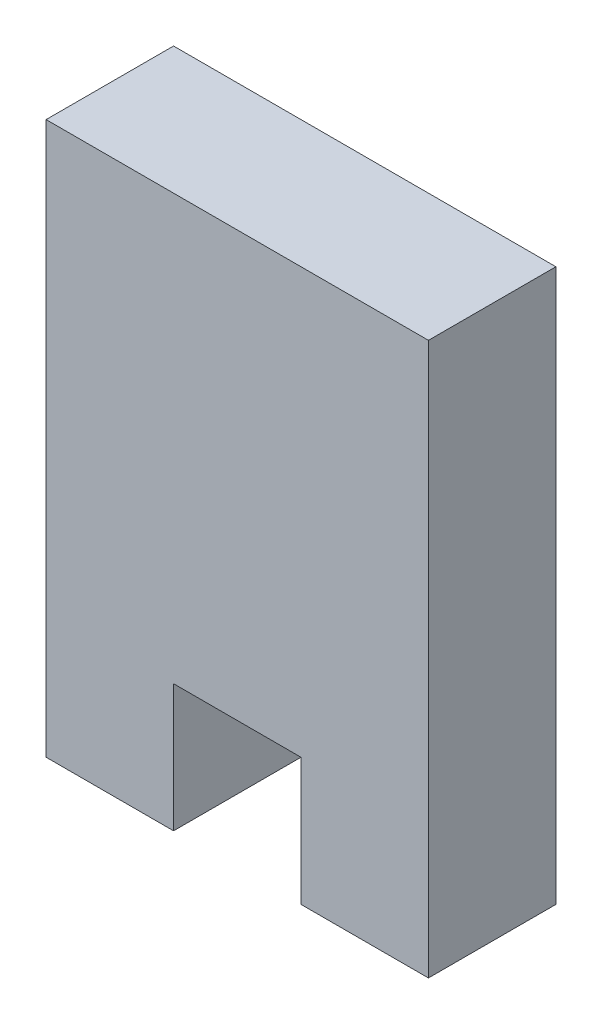
ISO-10303-21;
HEADER;
FILE_DESCRIPTION(('STEP AP214'),'2;1');
FILE_NAME('part.step','',(''),(''),'','','');
FILE_SCHEMA(('AUTOMOTIVE_DESIGN { 1 0 10303 214 1 1 1 1 }'));
ENDSEC;
DATA;
#1=APPLICATION_CONTEXT('core data for automotive mechanical design processes');
#2=APPLICATION_PROTOCOL_DEFINITION('international standard','automotive_design',2000,#1);
#3=PRODUCT_CONTEXT('',#1,'mechanical');
#4=PRODUCT('Part','Part','',(#3));
#5=PRODUCT_RELATED_PRODUCT_CATEGORY('part','',(#4));
#6=PRODUCT_DEFINITION_FORMATION('','',#4);
#7=PRODUCT_DEFINITION_CONTEXT('part definition',#1,'design');
#8=PRODUCT_DEFINITION('design','',#6,#7);
#9=PRODUCT_DEFINITION_SHAPE('','',#8);
#10=(LENGTH_UNIT() NAMED_UNIT(*) SI_UNIT(.MILLI.,.METRE.));
#11=(NAMED_UNIT(*) PLANE_ANGLE_UNIT() SI_UNIT($,.RADIAN.));
#12=(NAMED_UNIT(*) SI_UNIT($,.STERADIAN.) SOLID_ANGLE_UNIT());
#13=UNCERTAINTY_MEASURE_WITH_UNIT(LENGTH_MEASURE(1.E-05),#10,'distance_accuracy_value','');
#14=(GEOMETRIC_REPRESENTATION_CONTEXT(3) GLOBAL_UNCERTAINTY_ASSIGNED_CONTEXT((#13)) GLOBAL_UNIT_ASSIGNED_CONTEXT((#10,
#11,#12)) REPRESENTATION_CONTEXT('',''));
#15=CARTESIAN_POINT('',(0.,0.,0.));
#16=DIRECTION('',(0.,0.,1.));
#17=DIRECTION('',(1.,0.,0.));
#18=AXIS2_PLACEMENT_3D('',#15,#16,#17);
#19=CARTESIAN_POINT('',(-10.5816350683352,-7.34177998721548,3.));
#20=DIRECTION('',(1.,0.,0.));
#21=DIRECTION('',(0.,0.,-1.));
#22=AXIS2_PLACEMENT_3D('',#19,#20,#21);
#23=PLANE('',#22);
#24=DIRECTION('',(0.,-1.,0.));
#25=VECTOR('',#24,1.);
#26=CARTESIAN_POINT('',(-10.5816350683352,-7.34177998721548,0.));
#27=LINE('',#26,#25);
#28=CARTESIAN_POINT('',(-10.5816350683352,-7.34177998721548,0.));
#29=VERTEX_POINT('',#28);
#30=CARTESIAN_POINT('',(-10.5816350683352,-20.3417799872155,0.));
#31=VERTEX_POINT('',#30);
#32=EDGE_CURVE('E132',#29,#31,#27,.T.);
#33=ORIENTED_EDGE('',*,*,#32,.T.);
#34=DIRECTION('',(0.,0.,-1.));
#35=VECTOR('',#34,1.);
#36=CARTESIAN_POINT('',(-10.5816350683352,-20.3417799872155,3.));
#37=LINE('',#36,#35);
#38=CARTESIAN_POINT('',(-10.5816350683352,-20.3417799872155,3.));
#39=VERTEX_POINT('',#38);
#40=EDGE_CURVE('E11',#39,#31,#37,.T.);
#41=ORIENTED_EDGE('',*,*,#40,.F.);
#42=DIRECTION('',(0.,-1.,0.));
#43=VECTOR('',#42,1.);
#44=CARTESIAN_POINT('',(-10.5816350683352,-7.34177998721548,3.));
#45=LINE('',#44,#43);
#46=CARTESIAN_POINT('',(-10.5816350683352,-7.34177998721548,3.));
#47=VERTEX_POINT('',#46);
#48=EDGE_CURVE('E146',#47,#39,#45,.T.);
#49=ORIENTED_EDGE('',*,*,#48,.F.);
#50=DIRECTION('',(0.,0.,-1.));
#51=VECTOR('',#50,1.);
#52=CARTESIAN_POINT('',(-10.5816350683352,-7.34177998721548,3.));
#53=LINE('',#52,#51);
#54=EDGE_CURVE('E128',#47,#29,#53,.T.);
#55=ORIENTED_EDGE('',*,*,#54,.T.);
#56=EDGE_LOOP('',(#33,#41,#49,#55));
#57=FACE_BOUND('',#56,.T.);
#58=ADVANCED_FACE('F36',(#57),#23,.F.);
#59=CARTESIAN_POINT('',(-10.5816350683352,-20.3417799872155,3.));
#60=DIRECTION('',(0.,1.,0.));
#61=DIRECTION('',(-1.,0.,0.));
#62=AXIS2_PLACEMENT_3D('',#59,#60,#61);
#63=PLANE('',#62);
#64=DIRECTION('',(1.,0.,0.));
#65=VECTOR('',#64,1.);
#66=CARTESIAN_POINT('',(-10.5816350683352,-20.3417799872155,0.));
#67=LINE('',#66,#65);
#68=CARTESIAN_POINT('',(-7.5816350683352,-20.3417799872155,0.));
#69=VERTEX_POINT('',#68);
#70=EDGE_CURVE('E135',#31,#69,#67,.T.);
#71=ORIENTED_EDGE('',*,*,#70,.T.);
#72=DIRECTION('',(0.,0.,-1.));
#73=VECTOR('',#72,1.);
#74=CARTESIAN_POINT('',(-7.5816350683352,-20.3417799872155,3.));
#75=LINE('',#74,#73);
#76=CARTESIAN_POINT('',(-7.5816350683352,-20.3417799872155,3.));
#77=VERTEX_POINT('',#76);
#78=EDGE_CURVE('E44',#77,#69,#75,.T.);
#79=ORIENTED_EDGE('',*,*,#78,.F.);
#80=DIRECTION('',(1.,0.,0.));
#81=VECTOR('',#80,1.);
#82=CARTESIAN_POINT('',(-10.5816350683352,-20.3417799872155,3.));
#83=LINE('',#82,#81);
#84=EDGE_CURVE('E95',#39,#77,#83,.T.);
#85=ORIENTED_EDGE('',*,*,#84,.F.);
#86=ORIENTED_EDGE('',*,*,#40,.T.);
#87=EDGE_LOOP('',(#71,#79,#85,#86));
#88=FACE_BOUND('',#87,.T.);
#89=ADVANCED_FACE('F181',(#88),#63,.F.);
#90=CARTESIAN_POINT('',(-7.5816350683352,-17.3417799872155,3.));
#91=DIRECTION('',(-1.,0.,0.));
#92=DIRECTION('',(0.,-1.,0.));
#93=AXIS2_PLACEMENT_3D('',#90,#91,#92);
#94=PLANE('',#93);
#95=DIRECTION('',(0.,1.,0.));
#96=VECTOR('',#95,1.);
#97=CARTESIAN_POINT('',(-7.5816350683352,-17.3417799872155,0.));
#98=LINE('',#97,#96);
#99=CARTESIAN_POINT('',(-7.5816350683352,-17.3417799872155,0.));
#100=VERTEX_POINT('',#99);
#101=EDGE_CURVE('E137',#69,#100,#98,.T.);
#102=ORIENTED_EDGE('',*,*,#101,.T.);
#103=DIRECTION('',(0.,0.,-1.));
#104=VECTOR('',#103,1.);
#105=CARTESIAN_POINT('',(-7.5816350683352,-17.3417799872155,3.));
#106=LINE('',#105,#104);
#107=CARTESIAN_POINT('',(-7.5816350683352,-17.3417799872155,3.));
#108=VERTEX_POINT('',#107);
#109=EDGE_CURVE('E153',#108,#100,#106,.T.);
#110=ORIENTED_EDGE('',*,*,#109,.F.);
#111=DIRECTION('',(0.,1.,0.));
#112=VECTOR('',#111,1.);
#113=CARTESIAN_POINT('',(-7.5816350683352,-17.3417799872155,3.));
#114=LINE('',#113,#112);
#115=EDGE_CURVE('E161',#77,#108,#114,.T.);
#116=ORIENTED_EDGE('',*,*,#115,.F.);
#117=ORIENTED_EDGE('',*,*,#78,.T.);
#118=EDGE_LOOP('',(#102,#110,#116,#117));
#119=FACE_BOUND('',#118,.T.);
#120=ADVANCED_FACE('F159',(#119),#94,.F.);
#121=CARTESIAN_POINT('',(-7.5816350683352,-17.3417799872155,3.));
#122=DIRECTION('',(0.,1.,0.));
#123=DIRECTION('',(-1.,0.,0.));
#124=AXIS2_PLACEMENT_3D('',#121,#122,#123);
#125=PLANE('',#124);
#126=DIRECTION('',(1.,0.,0.));
#127=VECTOR('',#126,1.);
#128=CARTESIAN_POINT('',(-7.5816350683352,-17.3417799872155,0.));
#129=LINE('',#128,#127);
#130=CARTESIAN_POINT('',(-4.5816350683352,-17.3417799872155,0.));
#131=VERTEX_POINT('',#130);
#132=EDGE_CURVE('E139',#100,#131,#129,.T.);
#133=ORIENTED_EDGE('',*,*,#132,.T.);
#134=DIRECTION('',(0.,0.,-1.));
#135=VECTOR('',#134,1.);
#136=CARTESIAN_POINT('',(-4.5816350683352,-17.3417799872155,3.));
#137=LINE('',#136,#135);
#138=CARTESIAN_POINT('',(-4.5816350683352,-17.3417799872155,3.));
#139=VERTEX_POINT('',#138);
#140=EDGE_CURVE('E150',#139,#131,#137,.T.);
#141=ORIENTED_EDGE('',*,*,#140,.F.);
#142=DIRECTION('',(1.,0.,0.));
#143=VECTOR('',#142,1.);
#144=CARTESIAN_POINT('',(-7.5816350683352,-17.3417799872155,3.));
#145=LINE('',#144,#143);
#146=EDGE_CURVE('E173',#108,#139,#145,.T.);
#147=ORIENTED_EDGE('',*,*,#146,.F.);
#148=ORIENTED_EDGE('',*,*,#109,.T.);
#149=EDGE_LOOP('',(#133,#141,#147,#148));
#150=FACE_BOUND('',#149,.T.);
#151=ADVANCED_FACE('F169',(#150),#125,.F.);
#152=CARTESIAN_POINT('',(-4.5816350683352,-17.3417799872155,3.));
#153=DIRECTION('',(1.,0.,0.));
#154=DIRECTION('',(0.,1.,0.));
#155=AXIS2_PLACEMENT_3D('',#152,#153,#154);
#156=PLANE('',#155);
#157=DIRECTION('',(0.,-1.,0.));
#158=VECTOR('',#157,1.);
#159=CARTESIAN_POINT('',(-4.5816350683352,-17.3417799872155,0.));
#160=LINE('',#159,#158);
#161=CARTESIAN_POINT('',(-4.5816350683352,-20.3417799872155,0.));
#162=VERTEX_POINT('',#161);
#163=EDGE_CURVE('E141',#131,#162,#160,.T.);
#164=ORIENTED_EDGE('',*,*,#163,.T.);
#165=DIRECTION('',(0.,0.,-1.));
#166=VECTOR('',#165,1.);
#167=CARTESIAN_POINT('',(-4.5816350683352,-20.3417799872155,3.));
#168=LINE('',#167,#166);
#169=CARTESIAN_POINT('',(-4.5816350683352,-20.3417799872155,3.));
#170=VERTEX_POINT('',#169);
#171=EDGE_CURVE('E123',#170,#162,#168,.T.);
#172=ORIENTED_EDGE('',*,*,#171,.F.);
#173=DIRECTION('',(0.,-1.,0.));
#174=VECTOR('',#173,1.);
#175=CARTESIAN_POINT('',(-4.5816350683352,-17.3417799872155,3.));
#176=LINE('',#175,#174);
#177=EDGE_CURVE('E114',#139,#170,#176,.T.);
#178=ORIENTED_EDGE('',*,*,#177,.F.);
#179=ORIENTED_EDGE('',*,*,#140,.T.);
#180=EDGE_LOOP('',(#164,#172,#178,#179));
#181=FACE_BOUND('',#180,.T.);
#182=ADVANCED_FACE('F172',(#181),#156,.F.);
#183=CARTESIAN_POINT('',(-4.5816350683352,-20.3417799872155,3.));
#184=DIRECTION('',(0.,1.,0.));
#185=DIRECTION('',(0.,0.,1.));
#186=AXIS2_PLACEMENT_3D('',#183,#184,#185);
#187=PLANE('',#186);
#188=DIRECTION('',(1.,0.,0.));
#189=VECTOR('',#188,1.);
#190=CARTESIAN_POINT('',(-4.5816350683352,-20.3417799872155,0.));
#191=LINE('',#190,#189);
#192=CARTESIAN_POINT('',(-1.58163506833519,-20.3417799872155,0.));
#193=VERTEX_POINT('',#192);
#194=EDGE_CURVE('E122',#162,#193,#191,.T.);
#195=ORIENTED_EDGE('',*,*,#194,.T.);
#196=DIRECTION('',(0.,0.,-1.));
#197=VECTOR('',#196,1.);
#198=CARTESIAN_POINT('',(-1.58163506833519,-20.3417799872155,3.));
#199=LINE('',#198,#197);
#200=CARTESIAN_POINT('',(-1.58163506833519,-20.3417799872155,3.));
#201=VERTEX_POINT('',#200);
#202=EDGE_CURVE('E119',#201,#193,#199,.T.);
#203=ORIENTED_EDGE('',*,*,#202,.F.);
#204=DIRECTION('',(1.,0.,0.));
#205=VECTOR('',#204,1.);
#206=CARTESIAN_POINT('',(-4.5816350683352,-20.3417799872155,3.));
#207=LINE('',#206,#205);
#208=EDGE_CURVE('E108',#170,#201,#207,.T.);
#209=ORIENTED_EDGE('',*,*,#208,.F.);
#210=ORIENTED_EDGE('',*,*,#171,.T.);
#211=EDGE_LOOP('',(#195,#203,#209,#210));
#212=FACE_BOUND('',#211,.T.);
#213=ADVANCED_FACE('F120',(#212),#187,.F.);
#214=CARTESIAN_POINT('',(-1.5816350683352,-7.34177998721547,3.));
#215=DIRECTION('',(-1.,0.,0.));
#216=DIRECTION('',(0.,-1.,0.));
#217=AXIS2_PLACEMENT_3D('',#214,#215,#216);
#218=PLANE('',#217);
#219=DIRECTION('',(0.,1.,0.));
#220=VECTOR('',#219,1.);
#221=CARTESIAN_POINT('',(-1.5816350683352,-7.34177998721547,0.));
#222=LINE('',#221,#220);
#223=CARTESIAN_POINT('',(-1.5816350683352,-7.34177998721547,0.));
#224=VERTEX_POINT('',#223);
#225=EDGE_CURVE('E81',#193,#224,#222,.T.);
#226=ORIENTED_EDGE('',*,*,#225,.T.);
#227=DIRECTION('',(0.,0.,-1.));
#228=VECTOR('',#227,1.);
#229=CARTESIAN_POINT('',(-1.5816350683352,-7.34177998721547,3.));
#230=LINE('',#229,#228);
#231=CARTESIAN_POINT('',(-1.5816350683352,-7.34177998721547,3.));
#232=VERTEX_POINT('',#231);
#233=EDGE_CURVE('E124',#232,#224,#230,.T.);
#234=ORIENTED_EDGE('',*,*,#233,.F.);
#235=DIRECTION('',(0.,1.,0.));
#236=VECTOR('',#235,1.);
#237=CARTESIAN_POINT('',(-1.5816350683352,-7.34177998721547,3.));
#238=LINE('',#237,#236);
#239=EDGE_CURVE('E112',#201,#232,#238,.T.);
#240=ORIENTED_EDGE('',*,*,#239,.F.);
#241=ORIENTED_EDGE('',*,*,#202,.T.);
#242=EDGE_LOOP('',(#226,#234,#240,#241));
#243=FACE_BOUND('',#242,.T.);
#244=ADVANCED_FACE('F126',(#243),#218,.F.);
#245=CARTESIAN_POINT('',(-10.5816350683352,-7.34177998721548,3.));
#246=DIRECTION('',(0.,-1.,0.));
#247=DIRECTION('',(1.,0.,0.));
#248=AXIS2_PLACEMENT_3D('',#245,#246,#247);
#249=PLANE('',#248);
#250=DIRECTION('',(-1.,0.,0.));
#251=VECTOR('',#250,1.);
#252=CARTESIAN_POINT('',(-10.5816350683352,-7.34177998721548,0.));
#253=LINE('',#252,#251);
#254=EDGE_CURVE('E87',#224,#29,#253,.T.);
#255=ORIENTED_EDGE('',*,*,#254,.T.);
#256=ORIENTED_EDGE('',*,*,#54,.F.);
#257=DIRECTION('',(-1.,0.,0.));
#258=VECTOR('',#257,1.);
#259=CARTESIAN_POINT('',(-10.5816350683352,-7.34177998721548,3.));
#260=LINE('',#259,#258);
#261=EDGE_CURVE('E52',#232,#47,#260,.T.);
#262=ORIENTED_EDGE('',*,*,#261,.F.);
#263=ORIENTED_EDGE('',*,*,#233,.T.);
#264=EDGE_LOOP('',(#255,#256,#262,#263));
#265=FACE_BOUND('',#264,.T.);
#266=ADVANCED_FACE('F197',(#265),#249,.F.);
#267=CARTESIAN_POINT('',(0.,0.,3.));
#268=DIRECTION('',(0.,0.,1.));
#269=DIRECTION('',(1.,0.,0.));
#270=AXIS2_PLACEMENT_3D('',#267,#268,#269);
#271=PLANE('',#270);
#272=ORIENTED_EDGE('',*,*,#48,.T.);
#273=ORIENTED_EDGE('',*,*,#84,.T.);
#274=ORIENTED_EDGE('',*,*,#115,.T.);
#275=ORIENTED_EDGE('',*,*,#146,.T.);
#276=ORIENTED_EDGE('',*,*,#177,.T.);
#277=ORIENTED_EDGE('',*,*,#208,.T.);
#278=ORIENTED_EDGE('',*,*,#239,.T.);
#279=ORIENTED_EDGE('',*,*,#261,.T.);
#280=EDGE_LOOP('',(#272,#273,#274,#275,#276,#277,#278,#279));
#281=FACE_BOUND('',#280,.T.);
#282=ADVANCED_FACE('F110',(#281),#271,.T.);
#283=CARTESIAN_POINT('',(0.,0.,0.));
#284=DIRECTION('',(0.,0.,1.));
#285=DIRECTION('',(1.,0.,0.));
#286=AXIS2_PLACEMENT_3D('',#283,#284,#285);
#287=PLANE('',#286);
#288=ORIENTED_EDGE('',*,*,#32,.F.);
#289=ORIENTED_EDGE('',*,*,#254,.F.);
#290=ORIENTED_EDGE('',*,*,#225,.F.);
#291=ORIENTED_EDGE('',*,*,#194,.F.);
#292=ORIENTED_EDGE('',*,*,#163,.F.);
#293=ORIENTED_EDGE('',*,*,#132,.F.);
#294=ORIENTED_EDGE('',*,*,#101,.F.);
#295=ORIENTED_EDGE('',*,*,#70,.F.);
#296=EDGE_LOOP('',(#288,#289,#290,#291,#292,#293,#294,#295));
#297=FACE_BOUND('',#296,.T.);
#298=ADVANCED_FACE('F165',(#297),#287,.F.);
#299=CLOSED_SHELL('',(#58,#89,#120,#151,#182,#213,#244,#266,#282,#298));
#300=MANIFOLD_SOLID_BREP('B2',#299);
#301=ADVANCED_BREP_SHAPE_REPRESENTATION('',(#18,#300),#14);
#302=SHAPE_DEFINITION_REPRESENTATION(#9,#301);
ENDSEC;
END-ISO-10303-21;
